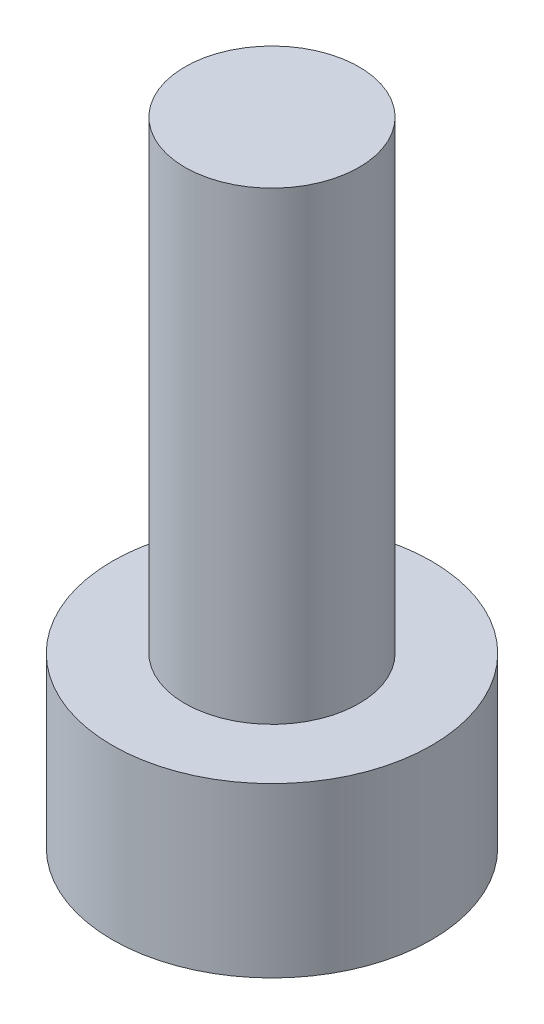
ISO-10303-21;
HEADER;
FILE_DESCRIPTION(('STEP AP214'),'2;1');
FILE_NAME('part.step','',(''),(''),'','','');
FILE_SCHEMA(('AUTOMOTIVE_DESIGN { 1 0 10303 214 1 1 1 1 }'));
ENDSEC;
DATA;
#1=APPLICATION_CONTEXT('core data for automotive mechanical design processes');
#2=APPLICATION_PROTOCOL_DEFINITION('international standard','automotive_design',2000,#1);
#3=PRODUCT_CONTEXT('',#1,'mechanical');
#4=PRODUCT('Part','Part','',(#3));
#5=PRODUCT_RELATED_PRODUCT_CATEGORY('part','',(#4));
#6=PRODUCT_DEFINITION_FORMATION('','',#4);
#7=PRODUCT_DEFINITION_CONTEXT('part definition',#1,'design');
#8=PRODUCT_DEFINITION('design','',#6,#7);
#9=PRODUCT_DEFINITION_SHAPE('','',#8);
#10=(LENGTH_UNIT() NAMED_UNIT(*) SI_UNIT(.MILLI.,.METRE.));
#11=(NAMED_UNIT(*) PLANE_ANGLE_UNIT() SI_UNIT($,.RADIAN.));
#12=(NAMED_UNIT(*) SI_UNIT($,.STERADIAN.) SOLID_ANGLE_UNIT());
#13=UNCERTAINTY_MEASURE_WITH_UNIT(LENGTH_MEASURE(1.E-05),#10,'distance_accuracy_value','');
#14=(GEOMETRIC_REPRESENTATION_CONTEXT(3) GLOBAL_UNCERTAINTY_ASSIGNED_CONTEXT((#13)) GLOBAL_UNIT_ASSIGNED_CONTEXT((#10,
#11,#12)) REPRESENTATION_CONTEXT('',''));
#15=CARTESIAN_POINT('',(0.,0.,0.));
#16=DIRECTION('',(0.,0.,1.));
#17=DIRECTION('',(1.,0.,0.));
#18=AXIS2_PLACEMENT_3D('',#15,#16,#17);
#19=CARTESIAN_POINT('',(0.,8.,0.));
#20=DIRECTION('',(0.,-1.,0.));
#21=DIRECTION('',(0.,0.,-1.));
#22=AXIS2_PLACEMENT_3D('',#19,#20,#21);
#23=CYLINDRICAL_SURFACE('',#22,1.5);
#24=CARTESIAN_POINT('',(0.,8.,0.));
#25=DIRECTION('',(0.,1.,0.));
#26=DIRECTION('',(0.,0.,1.));
#27=AXIS2_PLACEMENT_3D('',#24,#25,#26);
#28=CIRCLE('',#27,1.5);
#29=CARTESIAN_POINT('',(0.,8.,1.5));
#30=VERTEX_POINT('',#29);
#31=EDGE_CURVE('E11',#30,#30,#28,.T.);
#32=ORIENTED_EDGE('',*,*,#31,.F.);
#33=EDGE_LOOP('',(#32));
#34=FACE_BOUND('',#33,.T.);
#35=CARTESIAN_POINT('',(0.,0.,0.));
#36=DIRECTION('',(0.,1.,0.));
#37=DIRECTION('',(0.,0.,1.));
#38=AXIS2_PLACEMENT_3D('',#35,#36,#37);
#39=CIRCLE('',#38,1.5);
#40=CARTESIAN_POINT('',(0.,0.,1.5));
#41=VERTEX_POINT('',#40);
#42=EDGE_CURVE('E44',#41,#41,#39,.T.);
#43=ORIENTED_EDGE('',*,*,#42,.T.);
#44=EDGE_LOOP('',(#43));
#45=FACE_BOUND('',#44,.T.);
#46=ADVANCED_FACE('F41',(#34,#45),#23,.T.);
#47=CARTESIAN_POINT('',(0.,8.,0.));
#48=DIRECTION('',(0.,1.,0.));
#49=DIRECTION('',(0.,0.,1.));
#50=AXIS2_PLACEMENT_3D('',#47,#48,#49);
#51=PLANE('',#50);
#52=ORIENTED_EDGE('',*,*,#31,.T.);
#53=EDGE_LOOP('',(#52));
#54=FACE_BOUND('',#53,.T.);
#55=ADVANCED_FACE('F174',(#54),#51,.T.);
#56=CARTESIAN_POINT('',(0.,-2.9,0.));
#57=DIRECTION('',(0.,1.,0.));
#58=DIRECTION('',(0.,0.,1.));
#59=AXIS2_PLACEMENT_3D('',#56,#57,#58);
#60=CYLINDRICAL_SURFACE('',#59,2.75);
#61=CARTESIAN_POINT('',(0.,-2.9,0.));
#62=DIRECTION('',(0.,-1.,0.));
#63=DIRECTION('',(0.,0.,-1.));
#64=AXIS2_PLACEMENT_3D('',#61,#62,#63);
#65=CIRCLE('',#64,2.75);
#66=CARTESIAN_POINT('',(0.,-2.9,-2.75));
#67=VERTEX_POINT('',#66);
#68=EDGE_CURVE('E148',#67,#67,#65,.T.);
#69=ORIENTED_EDGE('',*,*,#68,.F.);
#70=EDGE_LOOP('',(#69));
#71=FACE_BOUND('',#70,.T.);
#72=CARTESIAN_POINT('',(0.,0.,0.));
#73=DIRECTION('',(0.,-1.,0.));
#74=DIRECTION('',(0.,0.,-1.));
#75=AXIS2_PLACEMENT_3D('',#72,#73,#74);
#76=CIRCLE('',#75,2.75);
#77=CARTESIAN_POINT('',(0.,0.,-2.75));
#78=VERTEX_POINT('',#77);
#79=EDGE_CURVE('E142',#78,#78,#76,.T.);
#80=ORIENTED_EDGE('',*,*,#79,.T.);
#81=EDGE_LOOP('',(#80));
#82=FACE_BOUND('',#81,.T.);
#83=ADVANCED_FACE('F154',(#71,#82),#60,.T.);
#84=CARTESIAN_POINT('',(0.,-2.9,0.));
#85=DIRECTION('',(0.,-1.,0.));
#86=DIRECTION('',(0.,0.,-1.));
#87=AXIS2_PLACEMENT_3D('',#84,#85,#86);
#88=PLANE('',#87);
#89=DIRECTION('',(0.,0.,1.));
#90=VECTOR('',#89,1.);
#91=CARTESIAN_POINT('',(1.25,-2.9,-0.721687836487033));
#92=LINE('',#91,#90);
#93=CARTESIAN_POINT('',(1.25,-2.9,-0.721687836487033));
#94=VERTEX_POINT('',#93);
#95=CARTESIAN_POINT('',(1.25,-2.9,0.721687836487032));
#96=VERTEX_POINT('',#95);
#97=EDGE_CURVE('E55',#94,#96,#92,.T.);
#98=ORIENTED_EDGE('',*,*,#97,.F.);
#99=DIRECTION('',(0.866025403784439,0.,0.5));
#100=VECTOR('',#99,1.);
#101=CARTESIAN_POINT('',(0.,-2.9,-1.44337567297406));
#102=LINE('',#101,#100);
#103=CARTESIAN_POINT('',(0.,-2.9,-1.44337567297406));
#104=VERTEX_POINT('',#103);
#105=EDGE_CURVE('E138',#104,#94,#102,.T.);
#106=ORIENTED_EDGE('',*,*,#105,.F.);
#107=DIRECTION('',(0.866025403784438,0.,-0.5));
#108=VECTOR('',#107,1.);
#109=CARTESIAN_POINT('',(-1.25,-2.9,-0.721687836487032));
#110=LINE('',#109,#108);
#111=CARTESIAN_POINT('',(-1.25,-2.9,-0.721687836487032));
#112=VERTEX_POINT('',#111);
#113=EDGE_CURVE('E136',#112,#104,#110,.T.);
#114=ORIENTED_EDGE('',*,*,#113,.F.);
#115=DIRECTION('',(0.,0.,-1.));
#116=VECTOR('',#115,1.);
#117=CARTESIAN_POINT('',(-1.25,-2.9,0.721687836487032));
#118=LINE('',#117,#116);
#119=CARTESIAN_POINT('',(-1.25,-2.9,0.721687836487032));
#120=VERTEX_POINT('',#119);
#121=EDGE_CURVE('E103',#120,#112,#118,.T.);
#122=ORIENTED_EDGE('',*,*,#121,.F.);
#123=DIRECTION('',(-0.866025403784439,0.,-0.5));
#124=VECTOR('',#123,1.);
#125=CARTESIAN_POINT('',(0.,-2.9,1.44337567297406));
#126=LINE('',#125,#124);
#127=CARTESIAN_POINT('',(0.,-2.9,1.44337567297406));
#128=VERTEX_POINT('',#127);
#129=EDGE_CURVE('E132',#128,#120,#126,.T.);
#130=ORIENTED_EDGE('',*,*,#129,.F.);
#131=DIRECTION('',(-0.866025403784439,0.,0.5));
#132=VECTOR('',#131,1.);
#133=CARTESIAN_POINT('',(1.25,-2.9,0.721687836487032));
#134=LINE('',#133,#132);
#135=EDGE_CURVE('E129',#96,#128,#134,.T.);
#136=ORIENTED_EDGE('',*,*,#135,.F.);
#137=EDGE_LOOP('',(#98,#106,#114,#122,#130,#136));
#138=FACE_BOUND('',#137,.T.);
#139=ORIENTED_EDGE('',*,*,#68,.T.);
#140=EDGE_LOOP('',(#139));
#141=FACE_BOUND('',#140,.T.);
#142=ADVANCED_FACE('F159',(#138,#141),#88,.T.);
#143=CARTESIAN_POINT('',(0.,0.,0.));
#144=DIRECTION('',(0.,-1.,0.));
#145=DIRECTION('',(0.,0.,-1.));
#146=AXIS2_PLACEMENT_3D('',#143,#144,#145);
#147=PLANE('',#146);
#148=ORIENTED_EDGE('',*,*,#42,.F.);
#149=EDGE_LOOP('',(#148));
#150=FACE_BOUND('',#149,.T.);
#151=ORIENTED_EDGE('',*,*,#79,.F.);
#152=EDGE_LOOP('',(#151));
#153=FACE_BOUND('',#152,.T.);
#154=ADVANCED_FACE('F156',(#150,#153),#147,.F.);
#155=CARTESIAN_POINT('',(1.25,-1.4,-0.721687836487033));
#156=DIRECTION('',(1.,0.,0.));
#157=DIRECTION('',(0.,0.,-1.));
#158=AXIS2_PLACEMENT_3D('',#155,#156,#157);
#159=PLANE('',#158);
#160=ORIENTED_EDGE('',*,*,#97,.T.);
#161=DIRECTION('',(0.,-1.,0.));
#162=VECTOR('',#161,1.);
#163=CARTESIAN_POINT('',(1.25,-1.4,0.721687836487032));
#164=LINE('',#163,#162);
#165=CARTESIAN_POINT('',(1.25,-1.4,0.721687836487032));
#166=VERTEX_POINT('',#165);
#167=EDGE_CURVE('E85',#166,#96,#164,.T.);
#168=ORIENTED_EDGE('',*,*,#167,.F.);
#169=DIRECTION('',(0.,0.,1.));
#170=VECTOR('',#169,1.);
#171=CARTESIAN_POINT('',(1.25,-1.4,-0.721687836487033));
#172=LINE('',#171,#170);
#173=CARTESIAN_POINT('',(1.25,-1.4,-0.721687836487033));
#174=VERTEX_POINT('',#173);
#175=EDGE_CURVE('E140',#174,#166,#172,.T.);
#176=ORIENTED_EDGE('',*,*,#175,.F.);
#177=DIRECTION('',(0.,-1.,0.));
#178=VECTOR('',#177,1.);
#179=CARTESIAN_POINT('',(1.25,-1.4,-0.721687836487033));
#180=LINE('',#179,#178);
#181=EDGE_CURVE('E63',#174,#94,#180,.T.);
#182=ORIENTED_EDGE('',*,*,#181,.T.);
#183=EDGE_LOOP('',(#160,#168,#176,#182));
#184=FACE_BOUND('',#183,.T.);
#185=ADVANCED_FACE('F158',(#184),#159,.F.);
#186=CARTESIAN_POINT('',(0.,-1.4,-1.44337567297406));
#187=DIRECTION('',(0.5,0.,-0.866025403784439));
#188=DIRECTION('',(-0.866025403784439,0.,-0.5));
#189=AXIS2_PLACEMENT_3D('',#186,#187,#188);
#190=PLANE('',#189);
#191=ORIENTED_EDGE('',*,*,#105,.T.);
#192=ORIENTED_EDGE('',*,*,#181,.F.);
#193=DIRECTION('',(0.866025403784439,0.,0.5));
#194=VECTOR('',#193,1.);
#195=CARTESIAN_POINT('',(0.,-1.4,-1.44337567297406));
#196=LINE('',#195,#194);
#197=CARTESIAN_POINT('',(0.,-1.4,-1.44337567297406));
#198=VERTEX_POINT('',#197);
#199=EDGE_CURVE('E115',#198,#174,#196,.T.);
#200=ORIENTED_EDGE('',*,*,#199,.F.);
#201=DIRECTION('',(0.,-1.,0.));
#202=VECTOR('',#201,1.);
#203=CARTESIAN_POINT('',(0.,-1.4,-1.44337567297406));
#204=LINE('',#203,#202);
#205=EDGE_CURVE('E107',#198,#104,#204,.T.);
#206=ORIENTED_EDGE('',*,*,#205,.T.);
#207=EDGE_LOOP('',(#191,#192,#200,#206));
#208=FACE_BOUND('',#207,.T.);
#209=ADVANCED_FACE('F167',(#208),#190,.F.);
#210=CARTESIAN_POINT('',(-1.25,-1.4,-0.721687836487032));
#211=DIRECTION('',(-0.5,0.,-0.866025403784439));
#212=DIRECTION('',(-0.866025403784439,0.,0.5));
#213=AXIS2_PLACEMENT_3D('',#210,#211,#212);
#214=PLANE('',#213);
#215=ORIENTED_EDGE('',*,*,#113,.T.);
#216=ORIENTED_EDGE('',*,*,#205,.F.);
#217=DIRECTION('',(0.866025403784438,0.,-0.5));
#218=VECTOR('',#217,1.);
#219=CARTESIAN_POINT('',(-1.25,-1.4,-0.721687836487032));
#220=LINE('',#219,#218);
#221=CARTESIAN_POINT('',(-1.25,-1.4,-0.721687836487032));
#222=VERTEX_POINT('',#221);
#223=EDGE_CURVE('E111',#222,#198,#220,.T.);
#224=ORIENTED_EDGE('',*,*,#223,.F.);
#225=DIRECTION('',(0.,-1.,0.));
#226=VECTOR('',#225,1.);
#227=CARTESIAN_POINT('',(-1.25,-1.4,-0.721687836487032));
#228=LINE('',#227,#226);
#229=EDGE_CURVE('E96',#222,#112,#228,.T.);
#230=ORIENTED_EDGE('',*,*,#229,.T.);
#231=EDGE_LOOP('',(#215,#216,#224,#230));
#232=FACE_BOUND('',#231,.T.);
#233=ADVANCED_FACE('F112',(#232),#214,.F.);
#234=CARTESIAN_POINT('',(-1.25,-1.4,0.721687836487032));
#235=DIRECTION('',(-1.,0.,0.));
#236=DIRECTION('',(0.,0.,1.));
#237=AXIS2_PLACEMENT_3D('',#234,#235,#236);
#238=PLANE('',#237);
#239=ORIENTED_EDGE('',*,*,#121,.T.);
#240=ORIENTED_EDGE('',*,*,#229,.F.);
#241=DIRECTION('',(0.,0.,-1.));
#242=VECTOR('',#241,1.);
#243=CARTESIAN_POINT('',(-1.25,-1.4,0.721687836487032));
#244=LINE('',#243,#242);
#245=CARTESIAN_POINT('',(-1.25,-1.4,0.721687836487032));
#246=VERTEX_POINT('',#245);
#247=EDGE_CURVE('E100',#246,#222,#244,.T.);
#248=ORIENTED_EDGE('',*,*,#247,.F.);
#249=DIRECTION('',(0.,-1.,0.));
#250=VECTOR('',#249,1.);
#251=CARTESIAN_POINT('',(-1.25,-1.4,0.721687836487032));
#252=LINE('',#251,#250);
#253=EDGE_CURVE('E108',#246,#120,#252,.T.);
#254=ORIENTED_EDGE('',*,*,#253,.T.);
#255=EDGE_LOOP('',(#239,#240,#248,#254));
#256=FACE_BOUND('',#255,.T.);
#257=ADVANCED_FACE('F98',(#256),#238,.F.);
#258=CARTESIAN_POINT('',(0.,-1.4,1.44337567297406));
#259=DIRECTION('',(-0.5,0.,0.866025403784439));
#260=DIRECTION('',(0.866025403784439,0.,0.5));
#261=AXIS2_PLACEMENT_3D('',#258,#259,#260);
#262=PLANE('',#261);
#263=ORIENTED_EDGE('',*,*,#129,.T.);
#264=ORIENTED_EDGE('',*,*,#253,.F.);
#265=DIRECTION('',(-0.866025403784439,0.,-0.5));
#266=VECTOR('',#265,1.);
#267=CARTESIAN_POINT('',(0.,-1.4,1.44337567297406));
#268=LINE('',#267,#266);
#269=CARTESIAN_POINT('',(0.,-1.4,1.44337567297406));
#270=VERTEX_POINT('',#269);
#271=EDGE_CURVE('E121',#270,#246,#268,.T.);
#272=ORIENTED_EDGE('',*,*,#271,.F.);
#273=DIRECTION('',(0.,-1.,0.));
#274=VECTOR('',#273,1.);
#275=CARTESIAN_POINT('',(0.,-1.4,1.44337567297406));
#276=LINE('',#275,#274);
#277=EDGE_CURVE('E145',#270,#128,#276,.T.);
#278=ORIENTED_EDGE('',*,*,#277,.T.);
#279=EDGE_LOOP('',(#263,#264,#272,#278));
#280=FACE_BOUND('',#279,.T.);
#281=ADVANCED_FACE('F235',(#280),#262,.F.);
#282=CARTESIAN_POINT('',(1.25,-1.4,0.721687836487032));
#283=DIRECTION('',(0.5,0.,0.866025403784439));
#284=DIRECTION('',(0.866025403784439,0.,-0.5));
#285=AXIS2_PLACEMENT_3D('',#282,#283,#284);
#286=PLANE('',#285);
#287=ORIENTED_EDGE('',*,*,#135,.T.);
#288=ORIENTED_EDGE('',*,*,#277,.F.);
#289=DIRECTION('',(-0.866025403784439,0.,0.5));
#290=VECTOR('',#289,1.);
#291=CARTESIAN_POINT('',(1.25,-1.4,0.721687836487032));
#292=LINE('',#291,#290);
#293=EDGE_CURVE('E123',#166,#270,#292,.T.);
#294=ORIENTED_EDGE('',*,*,#293,.F.);
#295=ORIENTED_EDGE('',*,*,#167,.T.);
#296=EDGE_LOOP('',(#287,#288,#294,#295));
#297=FACE_BOUND('',#296,.T.);
#298=ADVANCED_FACE('F244',(#297),#286,.F.);
#299=CARTESIAN_POINT('',(0.,-1.4,0.));
#300=DIRECTION('',(0.,-1.,0.));
#301=DIRECTION('',(0.,0.,-1.));
#302=AXIS2_PLACEMENT_3D('',#299,#300,#301);
#303=PLANE('',#302);
#304=ORIENTED_EDGE('',*,*,#175,.T.);
#305=ORIENTED_EDGE('',*,*,#293,.T.);
#306=ORIENTED_EDGE('',*,*,#271,.T.);
#307=ORIENTED_EDGE('',*,*,#247,.T.);
#308=ORIENTED_EDGE('',*,*,#223,.T.);
#309=ORIENTED_EDGE('',*,*,#199,.T.);
#310=EDGE_LOOP('',(#304,#305,#306,#307,#308,#309));
#311=FACE_BOUND('',#310,.T.);
#312=ADVANCED_FACE('F118',(#311),#303,.T.);
#313=CLOSED_SHELL('',(#46,#55,#83,#142,#154,#185,#209,#233,#257,#281,#298,#312));
#314=MANIFOLD_SOLID_BREP('B2',#313);
#315=ADVANCED_BREP_SHAPE_REPRESENTATION('',(#18,#314),#14);
#316=SHAPE_DEFINITION_REPRESENTATION(#9,#315);
ENDSEC;
END-ISO-10303-21;
